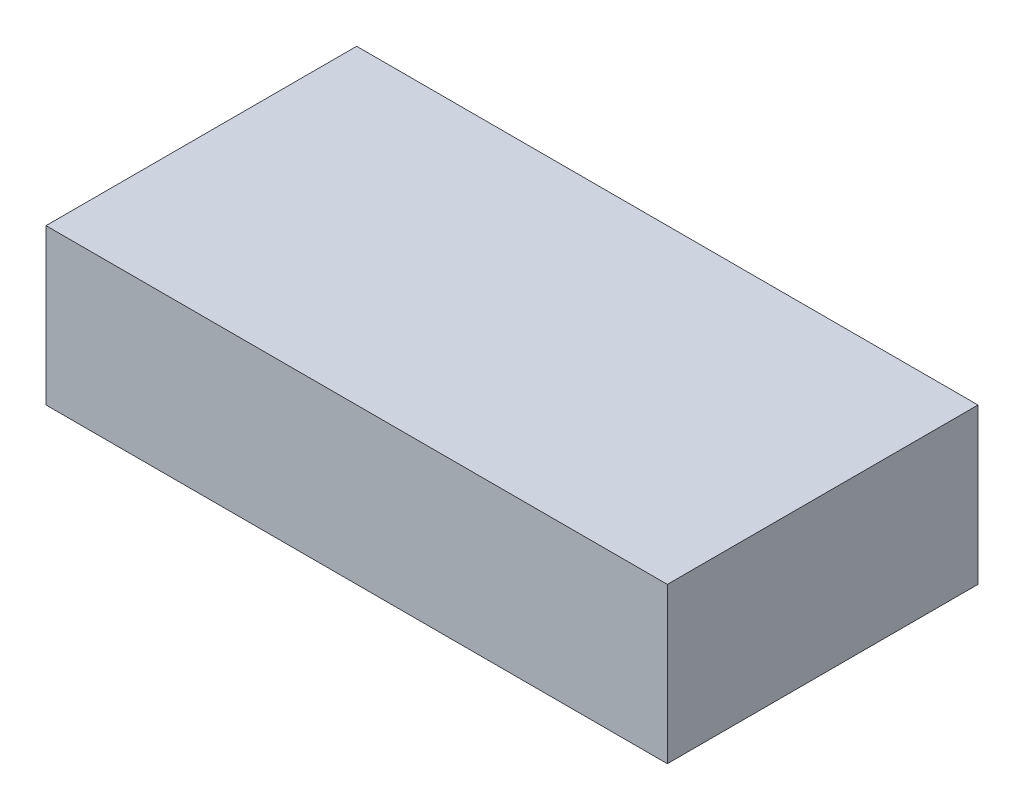
ISO-10303-21;
HEADER;
FILE_DESCRIPTION(('STEP AP214'),'2;1');
FILE_NAME('part.step','',(''),(''),'','','');
FILE_SCHEMA(('AUTOMOTIVE_DESIGN { 1 0 10303 214 1 1 1 1 }'));
ENDSEC;
DATA;
#1=APPLICATION_CONTEXT('core data for automotive mechanical design processes');
#2=APPLICATION_PROTOCOL_DEFINITION('international standard','automotive_design',2000,#1);
#3=PRODUCT_CONTEXT('',#1,'mechanical');
#4=PRODUCT('Part','Part','',(#3));
#5=PRODUCT_RELATED_PRODUCT_CATEGORY('part','',(#4));
#6=PRODUCT_DEFINITION_FORMATION('','',#4);
#7=PRODUCT_DEFINITION_CONTEXT('part definition',#1,'design');
#8=PRODUCT_DEFINITION('design','',#6,#7);
#9=PRODUCT_DEFINITION_SHAPE('','',#8);
#10=(LENGTH_UNIT() NAMED_UNIT(*) SI_UNIT(.MILLI.,.METRE.));
#11=(NAMED_UNIT(*) PLANE_ANGLE_UNIT() SI_UNIT($,.RADIAN.));
#12=(NAMED_UNIT(*) SI_UNIT($,.STERADIAN.) SOLID_ANGLE_UNIT());
#13=UNCERTAINTY_MEASURE_WITH_UNIT(LENGTH_MEASURE(1.E-05),#10,'distance_accuracy_value','');
#14=(GEOMETRIC_REPRESENTATION_CONTEXT(3) GLOBAL_UNCERTAINTY_ASSIGNED_CONTEXT((#13)) GLOBAL_UNIT_ASSIGNED_CONTEXT((#10,
#11,#12)) REPRESENTATION_CONTEXT('',''));
#15=CARTESIAN_POINT('',(0.,0.,0.));
#16=DIRECTION('',(0.,0.,1.));
#17=DIRECTION('',(1.,0.,0.));
#18=AXIS2_PLACEMENT_3D('',#15,#16,#17);
#19=CARTESIAN_POINT('',(100.,50.,50.));
#20=DIRECTION('',(-1.,0.,0.));
#21=DIRECTION('',(0.,0.,1.));
#22=AXIS2_PLACEMENT_3D('',#19,#20,#21);
#23=PLANE('',#22);
#24=DIRECTION('',(0.,0.,-1.));
#25=VECTOR('',#24,1.);
#26=CARTESIAN_POINT('',(100.,0.,50.));
#27=LINE('',#26,#25);
#28=CARTESIAN_POINT('',(100.,0.,50.));
#29=VERTEX_POINT('',#28);
#30=CARTESIAN_POINT('',(100.,0.,-50.));
#31=VERTEX_POINT('',#30);
#32=EDGE_CURVE('E98',#29,#31,#27,.T.);
#33=ORIENTED_EDGE('',*,*,#32,.T.);
#34=DIRECTION('',(0.,-1.,0.));
#35=VECTOR('',#34,1.);
#36=CARTESIAN_POINT('',(100.,50.,-50.));
#37=LINE('',#36,#35);
#38=CARTESIAN_POINT('',(100.,50.,-50.));
#39=VERTEX_POINT('',#38);
#40=EDGE_CURVE('E11',#39,#31,#37,.T.);
#41=ORIENTED_EDGE('',*,*,#40,.F.);
#42=DIRECTION('',(0.,0.,-1.));
#43=VECTOR('',#42,1.);
#44=CARTESIAN_POINT('',(100.,50.,50.));
#45=LINE('',#44,#43);
#46=CARTESIAN_POINT('',(100.,50.,50.));
#47=VERTEX_POINT('',#46);
#48=EDGE_CURVE('E86',#47,#39,#45,.T.);
#49=ORIENTED_EDGE('',*,*,#48,.F.);
#50=DIRECTION('',(0.,-1.,0.));
#51=VECTOR('',#50,1.);
#52=CARTESIAN_POINT('',(100.,50.,50.));
#53=LINE('',#52,#51);
#54=EDGE_CURVE('E94',#47,#29,#53,.T.);
#55=ORIENTED_EDGE('',*,*,#54,.T.);
#56=EDGE_LOOP('',(#33,#41,#49,#55));
#57=FACE_BOUND('',#56,.T.);
#58=ADVANCED_FACE('F35',(#57),#23,.F.);
#59=CARTESIAN_POINT('',(-100.,50.,-50.));
#60=DIRECTION('',(0.,0.,1.));
#61=DIRECTION('',(1.,0.,0.));
#62=AXIS2_PLACEMENT_3D('',#59,#60,#61);
#63=PLANE('',#62);
#64=DIRECTION('',(-1.,0.,0.));
#65=VECTOR('',#64,1.);
#66=CARTESIAN_POINT('',(-100.,0.,-50.));
#67=LINE('',#66,#65);
#68=CARTESIAN_POINT('',(-100.,0.,-50.));
#69=VERTEX_POINT('',#68);
#70=EDGE_CURVE('E90',#31,#69,#67,.T.);
#71=ORIENTED_EDGE('',*,*,#70,.T.);
#72=DIRECTION('',(0.,-1.,0.));
#73=VECTOR('',#72,1.);
#74=CARTESIAN_POINT('',(-100.,50.,-50.));
#75=LINE('',#74,#73);
#76=CARTESIAN_POINT('',(-100.,50.,-50.));
#77=VERTEX_POINT('',#76);
#78=EDGE_CURVE('E43',#77,#69,#75,.T.);
#79=ORIENTED_EDGE('',*,*,#78,.F.);
#80=DIRECTION('',(-1.,0.,0.));
#81=VECTOR('',#80,1.);
#82=CARTESIAN_POINT('',(-100.,50.,-50.));
#83=LINE('',#82,#81);
#84=EDGE_CURVE('E81',#39,#77,#83,.T.);
#85=ORIENTED_EDGE('',*,*,#84,.F.);
#86=ORIENTED_EDGE('',*,*,#40,.T.);
#87=EDGE_LOOP('',(#71,#79,#85,#86));
#88=FACE_BOUND('',#87,.T.);
#89=ADVANCED_FACE('F89',(#88),#63,.F.);
#90=CARTESIAN_POINT('',(-100.,50.,50.));
#91=DIRECTION('',(1.,0.,0.));
#92=DIRECTION('',(0.,0.,-1.));
#93=AXIS2_PLACEMENT_3D('',#90,#91,#92);
#94=PLANE('',#93);
#95=DIRECTION('',(0.,0.,1.));
#96=VECTOR('',#95,1.);
#97=CARTESIAN_POINT('',(-100.,0.,50.));
#98=LINE('',#97,#96);
#99=CARTESIAN_POINT('',(-100.,0.,50.));
#100=VERTEX_POINT('',#99);
#101=EDGE_CURVE('E68',#69,#100,#98,.T.);
#102=ORIENTED_EDGE('',*,*,#101,.T.);
#103=DIRECTION('',(0.,-1.,0.));
#104=VECTOR('',#103,1.);
#105=CARTESIAN_POINT('',(-100.,50.,50.));
#106=LINE('',#105,#104);
#107=CARTESIAN_POINT('',(-100.,50.,50.));
#108=VERTEX_POINT('',#107);
#109=EDGE_CURVE('E91',#108,#100,#106,.T.);
#110=ORIENTED_EDGE('',*,*,#109,.F.);
#111=DIRECTION('',(0.,0.,1.));
#112=VECTOR('',#111,1.);
#113=CARTESIAN_POINT('',(-100.,50.,50.));
#114=LINE('',#113,#112);
#115=EDGE_CURVE('E84',#77,#108,#114,.T.);
#116=ORIENTED_EDGE('',*,*,#115,.F.);
#117=ORIENTED_EDGE('',*,*,#78,.T.);
#118=EDGE_LOOP('',(#102,#110,#116,#117));
#119=FACE_BOUND('',#118,.T.);
#120=ADVANCED_FACE('F92',(#119),#94,.F.);
#121=CARTESIAN_POINT('',(-100.,50.,50.));
#122=DIRECTION('',(0.,0.,-1.));
#123=DIRECTION('',(-1.,0.,0.));
#124=AXIS2_PLACEMENT_3D('',#121,#122,#123);
#125=PLANE('',#124);
#126=DIRECTION('',(1.,0.,0.));
#127=VECTOR('',#126,1.);
#128=CARTESIAN_POINT('',(-100.,0.,50.));
#129=LINE('',#128,#127);
#130=EDGE_CURVE('E74',#100,#29,#129,.T.);
#131=ORIENTED_EDGE('',*,*,#130,.T.);
#132=ORIENTED_EDGE('',*,*,#54,.F.);
#133=DIRECTION('',(1.,0.,0.));
#134=VECTOR('',#133,1.);
#135=CARTESIAN_POINT('',(-100.,50.,50.));
#136=LINE('',#135,#134);
#137=EDGE_CURVE('E51',#108,#47,#136,.T.);
#138=ORIENTED_EDGE('',*,*,#137,.F.);
#139=ORIENTED_EDGE('',*,*,#109,.T.);
#140=EDGE_LOOP('',(#131,#132,#138,#139));
#141=FACE_BOUND('',#140,.T.);
#142=ADVANCED_FACE('F105',(#141),#125,.F.);
#143=CARTESIAN_POINT('',(0.,50.,0.));
#144=DIRECTION('',(0.,-1.,0.));
#145=DIRECTION('',(0.,0.,-1.));
#146=AXIS2_PLACEMENT_3D('',#143,#144,#145);
#147=PLANE('',#146);
#148=ORIENTED_EDGE('',*,*,#48,.T.);
#149=ORIENTED_EDGE('',*,*,#84,.T.);
#150=ORIENTED_EDGE('',*,*,#115,.T.);
#151=ORIENTED_EDGE('',*,*,#137,.T.);
#152=EDGE_LOOP('',(#148,#149,#150,#151));
#153=FACE_BOUND('',#152,.T.);
#154=ADVANCED_FACE('F82',(#153),#147,.F.);
#155=CARTESIAN_POINT('',(0.,0.,0.));
#156=DIRECTION('',(0.,-1.,0.));
#157=DIRECTION('',(0.,0.,-1.));
#158=AXIS2_PLACEMENT_3D('',#155,#156,#157);
#159=PLANE('',#158);
#160=ORIENTED_EDGE('',*,*,#32,.F.);
#161=ORIENTED_EDGE('',*,*,#130,.F.);
#162=ORIENTED_EDGE('',*,*,#101,.F.);
#163=ORIENTED_EDGE('',*,*,#70,.F.);
#164=EDGE_LOOP('',(#160,#161,#162,#163));
#165=FACE_BOUND('',#164,.T.);
#166=ADVANCED_FACE('F108',(#165),#159,.T.);
#167=CLOSED_SHELL('',(#58,#89,#120,#142,#154,#166));
#168=MANIFOLD_SOLID_BREP('B2',#167);
#169=ADVANCED_BREP_SHAPE_REPRESENTATION('',(#18,#168),#14);
#170=SHAPE_DEFINITION_REPRESENTATION(#9,#169);
ENDSEC;
END-ISO-10303-21;
